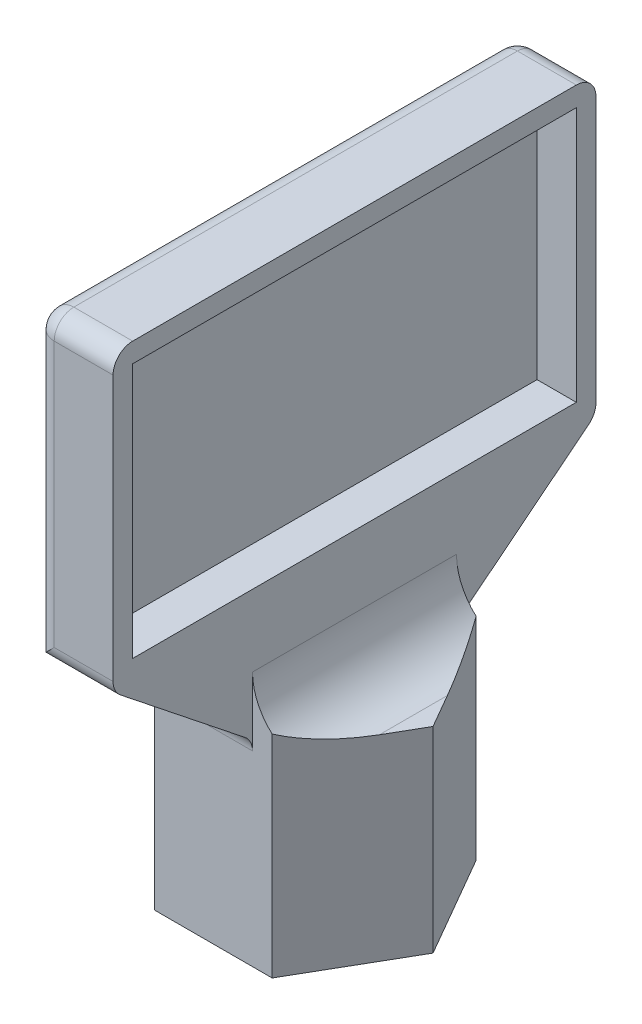
ISO-10303-21;
HEADER;
FILE_DESCRIPTION(('STEP AP214'),'2;1');
FILE_NAME('part.step','',(''),(''),'','','');
FILE_SCHEMA(('AUTOMOTIVE_DESIGN { 1 0 10303 214 1 1 1 1 }'));
ENDSEC;
DATA;
#1=APPLICATION_CONTEXT('core data for automotive mechanical design processes');
#2=APPLICATION_PROTOCOL_DEFINITION('international standard','automotive_design',2000,#1);
#3=PRODUCT_CONTEXT('',#1,'mechanical');
#4=PRODUCT('Part','Part','',(#3));
#5=PRODUCT_RELATED_PRODUCT_CATEGORY('part','',(#4));
#6=PRODUCT_DEFINITION_FORMATION('','',#4);
#7=PRODUCT_DEFINITION_CONTEXT('part definition',#1,'design');
#8=PRODUCT_DEFINITION('design','',#6,#7);
#9=PRODUCT_DEFINITION_SHAPE('','',#8);
#10=(LENGTH_UNIT() NAMED_UNIT(*) SI_UNIT(.MILLI.,.METRE.));
#11=(NAMED_UNIT(*) PLANE_ANGLE_UNIT() SI_UNIT($,.RADIAN.));
#12=(NAMED_UNIT(*) SI_UNIT($,.STERADIAN.) SOLID_ANGLE_UNIT());
#13=UNCERTAINTY_MEASURE_WITH_UNIT(LENGTH_MEASURE(1.E-05),#10,'distance_accuracy_value','');
#14=(GEOMETRIC_REPRESENTATION_CONTEXT(3) GLOBAL_UNCERTAINTY_ASSIGNED_CONTEXT((#13)) GLOBAL_UNIT_ASSIGNED_CONTEXT((#10,
#11,#12)) REPRESENTATION_CONTEXT('',''));
#15=CARTESIAN_POINT('',(0.,0.,0.));
#16=DIRECTION('',(0.,0.,1.));
#17=DIRECTION('',(1.,0.,0.));
#18=AXIS2_PLACEMENT_3D('',#15,#16,#17);
#19=CARTESIAN_POINT('',(0.,10.,0.));
#20=DIRECTION('',(0.,1.,0.));
#21=DIRECTION('',(0.,0.,1.));
#22=AXIS2_PLACEMENT_3D('',#19,#20,#21);
#23=PLANE('',#22);
#24=DIRECTION('',(-0.500000000000001,0.,-0.866025403784438));
#25=VECTOR('',#24,1.);
#26=CARTESIAN_POINT('',(6.00000000000006,10.,0.));
#27=LINE('',#26,#25);
#28=CARTESIAN_POINT('',(6.00000000000006,10.,0.));
#29=VERTEX_POINT('',#28);
#30=CARTESIAN_POINT('',(5.,10.,-1.73205080756898));
#31=VERTEX_POINT('',#30);
#32=EDGE_CURVE('E322',#29,#31,#27,.T.);
#33=ORIENTED_EDGE('',*,*,#32,.T.);
#34=DIRECTION('',(0.,0.,1.));
#35=VECTOR('',#34,1.);
#36=CARTESIAN_POINT('',(5.,10.,5.19615242270666));
#37=LINE('',#36,#35);
#38=CARTESIAN_POINT('',(5.,10.,1.732050807569));
#39=VERTEX_POINT('',#38);
#40=EDGE_CURVE('E511',#31,#39,#37,.T.);
#41=ORIENTED_EDGE('',*,*,#40,.T.);
#42=DIRECTION('',(0.499999999999995,0.,-0.866025403784441));
#43=VECTOR('',#42,1.);
#44=CARTESIAN_POINT('',(3.00000000000009,10.,5.19615242270665));
#45=LINE('',#44,#43);
#46=EDGE_CURVE('E319',#39,#29,#45,.T.);
#47=ORIENTED_EDGE('',*,*,#46,.T.);
#48=EDGE_LOOP('',(#33,#41,#47));
#49=FACE_BOUND('',#48,.T.);
#50=ADVANCED_FACE('F41',(#49),#23,.T.);
#51=CARTESIAN_POINT('',(3.00000000000009,10.,5.19615242270665));
#52=DIRECTION('',(-0.866025403784441,0.,-0.499999999999995));
#53=DIRECTION('',(-0.499999999999995,0.,0.866025403784441));
#54=AXIS2_PLACEMENT_3D('',#51,#52,#53);
#55=PLANE('',#54);
#56=DIRECTION('',(0.499999999999995,0.,-0.866025403784441));
#57=VECTOR('',#56,1.);
#58=CARTESIAN_POINT('',(3.00000000000009,0.,5.19615242270665));
#59=LINE('',#58,#57);
#60=CARTESIAN_POINT('',(3.00000000000009,0.,5.19615242270665));
#61=VERTEX_POINT('',#60);
#62=CARTESIAN_POINT('',(6.00000000000006,0.,0.));
#63=VERTEX_POINT('',#62);
#64=EDGE_CURVE('E315',#61,#63,#59,.T.);
#65=ORIENTED_EDGE('',*,*,#64,.T.);
#66=DIRECTION('',(0.,-1.,0.));
#67=VECTOR('',#66,1.);
#68=CARTESIAN_POINT('',(6.00000000000006,10.,0.));
#69=LINE('',#68,#67);
#70=EDGE_CURVE('E367',#29,#63,#69,.T.);
#71=ORIENTED_EDGE('',*,*,#70,.F.);
#72=ORIENTED_EDGE('',*,*,#46,.F.);
#73=CARTESIAN_POINT('',(5.,13.,1.73205080756901));
#74=DIRECTION('',(-0.866025403784441,0.,-0.499999999999995));
#75=DIRECTION('',(0.499999999999995,0.,-0.866025403784441));
#76=AXIS2_PLACEMENT_3D('',#73,#74,#75);
#77=ELLIPSE('',#76,6.00000000000006,3.);
#78=CARTESIAN_POINT('',(3.00000000000009,10.7639320225001,5.19615242270665));
#79=VERTEX_POINT('',#78);
#80=EDGE_CURVE('E534',#39,#79,#77,.T.);
#81=ORIENTED_EDGE('',*,*,#80,.T.);
#82=DIRECTION('',(0.,-1.,0.));
#83=VECTOR('',#82,1.);
#84=CARTESIAN_POINT('',(3.00000000000009,10.,5.19615242270665));
#85=LINE('',#84,#83);
#86=EDGE_CURVE('E64',#79,#61,#85,.T.);
#87=ORIENTED_EDGE('',*,*,#86,.T.);
#88=EDGE_LOOP('',(#65,#71,#72,#81,#87));
#89=FACE_BOUND('',#88,.T.);
#90=ADVANCED_FACE('F555',(#89),#55,.F.);
#91=CARTESIAN_POINT('',(6.00000000000006,10.,0.));
#92=DIRECTION('',(-0.866025403784438,0.,0.500000000000001));
#93=DIRECTION('',(0.500000000000001,0.,0.866025403784438));
#94=AXIS2_PLACEMENT_3D('',#91,#92,#93);
#95=PLANE('',#94);
#96=DIRECTION('',(-0.500000000000001,0.,-0.866025403784438));
#97=VECTOR('',#96,1.);
#98=CARTESIAN_POINT('',(6.00000000000006,0.,0.));
#99=LINE('',#98,#97);
#100=CARTESIAN_POINT('',(3.00000000000002,0.,-5.19615242270669));
#101=VERTEX_POINT('',#100);
#102=EDGE_CURVE('E337',#63,#101,#99,.T.);
#103=ORIENTED_EDGE('',*,*,#102,.T.);
#104=DIRECTION('',(0.,-1.,0.));
#105=VECTOR('',#104,1.);
#106=CARTESIAN_POINT('',(3.00000000000002,10.,-5.19615242270669));
#107=LINE('',#106,#105);
#108=CARTESIAN_POINT('',(3.00000000000002,10.7639320225002,-5.19615242270669));
#109=VERTEX_POINT('',#108);
#110=EDGE_CURVE('E56',#109,#101,#107,.T.);
#111=ORIENTED_EDGE('',*,*,#110,.F.);
#112=CARTESIAN_POINT('',(5.,13.,-1.73205080756898));
#113=DIRECTION('',(-0.866025403784438,0.,0.500000000000001));
#114=DIRECTION('',(-0.500000000000001,0.,-0.866025403784438));
#115=AXIS2_PLACEMENT_3D('',#112,#113,#114);
#116=ELLIPSE('',#115,5.99999999999999,3.);
#117=EDGE_CURVE('E11',#109,#31,#116,.T.);
#118=ORIENTED_EDGE('',*,*,#117,.T.);
#119=ORIENTED_EDGE('',*,*,#32,.F.);
#120=ORIENTED_EDGE('',*,*,#70,.T.);
#121=EDGE_LOOP('',(#103,#111,#118,#119,#120));
#122=FACE_BOUND('',#121,.T.);
#123=ADVANCED_FACE('F550',(#122),#95,.F.);
#124=CARTESIAN_POINT('',(3.00000000000002,10.,-5.19615242270669));
#125=DIRECTION('',(0.,0.,1.));
#126=DIRECTION('',(1.,0.,0.));
#127=AXIS2_PLACEMENT_3D('',#124,#125,#126);
#128=PLANE('',#127);
#129=DIRECTION('',(1.,0.,0.));
#130=VECTOR('',#129,1.);
#131=CARTESIAN_POINT('',(2.00000000000001,9.51771445827896,-5.19615242270667));
#132=LINE('',#131,#130);
#133=CARTESIAN_POINT('',(-2.,9.51771445827891,-5.19615242270661));
#134=VERTEX_POINT('',#133);
#135=CARTESIAN_POINT('',(2.,9.51771445827896,-5.19615242270667));
#136=VERTEX_POINT('',#135);
#137=EDGE_CURVE('E431',#134,#136,#132,.T.);
#138=ORIENTED_EDGE('',*,*,#137,.T.);
#139=DIRECTION('',(0.,1.,0.));
#140=VECTOR('',#139,1.);
#141=CARTESIAN_POINT('',(2.,10.,-5.19615242270667));
#142=LINE('',#141,#140);
#143=CARTESIAN_POINT('',(2.,13.,-5.19615242270667));
#144=VERTEX_POINT('',#143);
#145=EDGE_CURVE('E435',#136,#144,#142,.T.);
#146=ORIENTED_EDGE('',*,*,#145,.T.);
#147=CARTESIAN_POINT('',(5.,13.,-5.19615242270672));
#148=DIRECTION('',(0.,0.,1.));
#149=DIRECTION('',(1.,0.,0.));
#150=AXIS2_PLACEMENT_3D('',#147,#148,#149);
#151=CIRCLE('',#150,3.);
#152=EDGE_CURVE('E50',#144,#109,#151,.T.);
#153=ORIENTED_EDGE('',*,*,#152,.T.);
#154=ORIENTED_EDGE('',*,*,#110,.T.);
#155=DIRECTION('',(-1.,0.,0.));
#156=VECTOR('',#155,1.);
#157=CARTESIAN_POINT('',(3.00000000000002,0.,-5.19615242270669));
#158=LINE('',#157,#156);
#159=CARTESIAN_POINT('',(-2.99999999999992,0.,-5.19615242270659));
#160=VERTEX_POINT('',#159);
#161=EDGE_CURVE('E340',#101,#160,#158,.T.);
#162=ORIENTED_EDGE('',*,*,#161,.T.);
#163=DIRECTION('',(0.,-1.,0.));
#164=VECTOR('',#163,1.);
#165=CARTESIAN_POINT('',(-2.99999999999992,10.,-5.19615242270659));
#166=LINE('',#165,#164);
#167=CARTESIAN_POINT('',(-2.99999999999992,10.7639320225003,-5.19615242270659));
#168=VERTEX_POINT('',#167);
#169=EDGE_CURVE('E361',#168,#160,#166,.T.);
#170=ORIENTED_EDGE('',*,*,#169,.F.);
#171=CARTESIAN_POINT('',(-5.,13.,-5.19615242270655));
#172=DIRECTION('',(0.,0.,1.));
#173=DIRECTION('',(1.,0.,0.));
#174=AXIS2_PLACEMENT_3D('',#171,#172,#173);
#175=CIRCLE('',#174,3.);
#176=CARTESIAN_POINT('',(-2.,13.,-5.19615242270661));
#177=VERTEX_POINT('',#176);
#178=EDGE_CURVE('E530',#168,#177,#175,.T.);
#179=ORIENTED_EDGE('',*,*,#178,.T.);
#180=DIRECTION('',(0.,-1.,0.));
#181=VECTOR('',#180,1.);
#182=CARTESIAN_POINT('',(-2.,0.,-5.19615242270661));
#183=LINE('',#182,#181);
#184=EDGE_CURVE('E427',#177,#134,#183,.T.);
#185=ORIENTED_EDGE('',*,*,#184,.T.);
#186=EDGE_LOOP('',(#138,#146,#153,#154,#162,#170,#179,#185));
#187=FACE_BOUND('',#186,.T.);
#188=ADVANCED_FACE('F543',(#187),#128,.F.);
#189=CARTESIAN_POINT('',(-2.99999999999992,10.,-5.19615242270659));
#190=DIRECTION('',(0.866025403784439,0.,0.5));
#191=DIRECTION('',(0.5,0.,-0.866025403784439));
#192=AXIS2_PLACEMENT_3D('',#189,#190,#191);
#193=PLANE('',#192);
#194=DIRECTION('',(-0.5,0.,0.866025403784439));
#195=VECTOR('',#194,1.);
#196=CARTESIAN_POINT('',(-2.99999999999992,0.,-5.19615242270659));
#197=LINE('',#196,#195);
#198=CARTESIAN_POINT('',(-5.99999999999992,0.,0.));
#199=VERTEX_POINT('',#198);
#200=EDGE_CURVE('E343',#160,#199,#197,.T.);
#201=ORIENTED_EDGE('',*,*,#200,.T.);
#202=DIRECTION('',(0.,-1.,0.));
#203=VECTOR('',#202,1.);
#204=CARTESIAN_POINT('',(-5.99999999999992,10.,0.));
#205=LINE('',#204,#203);
#206=CARTESIAN_POINT('',(-5.99999999999992,10.,0.));
#207=VERTEX_POINT('',#206);
#208=EDGE_CURVE('E357',#207,#199,#205,.T.);
#209=ORIENTED_EDGE('',*,*,#208,.F.);
#210=DIRECTION('',(-0.5,0.,0.866025403784439));
#211=VECTOR('',#210,1.);
#212=CARTESIAN_POINT('',(-2.99999999999992,10.,-5.19615242270659));
#213=LINE('',#212,#211);
#214=CARTESIAN_POINT('',(-5.,10.,-1.7320508075687));
#215=VERTEX_POINT('',#214);
#216=EDGE_CURVE('E327',#215,#207,#213,.T.);
#217=ORIENTED_EDGE('',*,*,#216,.F.);
#218=CARTESIAN_POINT('',(-5.,13.,-1.7320508075687));
#219=DIRECTION('',(0.866025403784439,0.,0.5));
#220=DIRECTION('',(-0.5,0.,0.866025403784439));
#221=AXIS2_PLACEMENT_3D('',#218,#219,#220);
#222=ELLIPSE('',#221,6.,3.);
#223=EDGE_CURVE('E526',#215,#168,#222,.T.);
#224=ORIENTED_EDGE('',*,*,#223,.T.);
#225=ORIENTED_EDGE('',*,*,#169,.T.);
#226=EDGE_LOOP('',(#201,#209,#217,#224,#225));
#227=FACE_BOUND('',#226,.T.);
#228=ADVANCED_FACE('F564',(#227),#193,.F.);
#229=CARTESIAN_POINT('',(-5.99999999999992,10.,0.));
#230=DIRECTION('',(0.866025403784444,0.,-0.49999999999999));
#231=DIRECTION('',(-0.49999999999999,0.,-0.866025403784444));
#232=AXIS2_PLACEMENT_3D('',#229,#230,#231);
#233=PLANE('',#232);
#234=DIRECTION('',(0.49999999999999,0.,0.866025403784444));
#235=VECTOR('',#234,1.);
#236=CARTESIAN_POINT('',(-5.99999999999992,0.,0.));
#237=LINE('',#236,#235);
#238=CARTESIAN_POINT('',(-2.99999999999998,0.,5.19615242270671));
#239=VERTEX_POINT('',#238);
#240=EDGE_CURVE('E346',#199,#239,#237,.T.);
#241=ORIENTED_EDGE('',*,*,#240,.T.);
#242=DIRECTION('',(0.,-1.,0.));
#243=VECTOR('',#242,1.);
#244=CARTESIAN_POINT('',(-2.99999999999998,10.,5.19615242270671));
#245=LINE('',#244,#243);
#246=CARTESIAN_POINT('',(-2.99999999999998,10.7639320225002,5.19615242270671));
#247=VERTEX_POINT('',#246);
#248=EDGE_CURVE('E353',#247,#239,#245,.T.);
#249=ORIENTED_EDGE('',*,*,#248,.F.);
#250=CARTESIAN_POINT('',(-5.,13.,1.73205080756883));
#251=DIRECTION('',(0.866025403784444,0.,-0.49999999999999));
#252=DIRECTION('',(0.49999999999999,0.,0.866025403784444));
#253=AXIS2_PLACEMENT_3D('',#250,#251,#252);
#254=ELLIPSE('',#253,6.00000000000012,3.);
#255=CARTESIAN_POINT('',(-5.,10.,1.73205080756883));
#256=VERTEX_POINT('',#255);
#257=EDGE_CURVE('E523',#247,#256,#254,.T.);
#258=ORIENTED_EDGE('',*,*,#257,.T.);
#259=DIRECTION('',(0.49999999999999,0.,0.866025403784444));
#260=VECTOR('',#259,1.);
#261=CARTESIAN_POINT('',(-5.99999999999992,10.,0.));
#262=LINE('',#261,#260);
#263=EDGE_CURVE('E330',#207,#256,#262,.T.);
#264=ORIENTED_EDGE('',*,*,#263,.F.);
#265=ORIENTED_EDGE('',*,*,#208,.T.);
#266=EDGE_LOOP('',(#241,#249,#258,#264,#265));
#267=FACE_BOUND('',#266,.T.);
#268=ADVANCED_FACE('F669',(#267),#233,.F.);
#269=CARTESIAN_POINT('',(-2.99999999999998,10.,5.19615242270671));
#270=DIRECTION('',(0.,0.,-1.));
#271=DIRECTION('',(-1.,0.,0.));
#272=AXIS2_PLACEMENT_3D('',#269,#270,#271);
#273=PLANE('',#272);
#274=ORIENTED_EDGE('',*,*,#86,.F.);
#275=CARTESIAN_POINT('',(5.,13.,5.19615242270663));
#276=DIRECTION('',(0.,0.,-1.));
#277=DIRECTION('',(-1.,0.,0.));
#278=AXIS2_PLACEMENT_3D('',#275,#276,#277);
#279=CIRCLE('',#278,3.);
#280=CARTESIAN_POINT('',(2.,13.,5.19615242270666));
#281=VERTEX_POINT('',#280);
#282=EDGE_CURVE('E537',#79,#281,#279,.T.);
#283=ORIENTED_EDGE('',*,*,#282,.T.);
#284=DIRECTION('',(0.,-1.,0.));
#285=VECTOR('',#284,1.);
#286=CARTESIAN_POINT('',(2.,10.,5.19615242270666));
#287=LINE('',#286,#285);
#288=CARTESIAN_POINT('',(2.,9.51771445827886,5.19615242270666));
#289=VERTEX_POINT('',#288);
#290=EDGE_CURVE('E445',#281,#289,#287,.T.);
#291=ORIENTED_EDGE('',*,*,#290,.T.);
#292=DIRECTION('',(1.,0.,0.));
#293=VECTOR('',#292,1.);
#294=CARTESIAN_POINT('',(-2.99999999999999,9.5177144582789,5.19615242270671));
#295=LINE('',#294,#293);
#296=CARTESIAN_POINT('',(-2.,9.51771445827889,5.1961524227067));
#297=VERTEX_POINT('',#296);
#298=EDGE_CURVE('E441',#289,#297,#295,.F.);
#299=ORIENTED_EDGE('',*,*,#298,.T.);
#300=DIRECTION('',(0.,1.,0.));
#301=VECTOR('',#300,1.);
#302=CARTESIAN_POINT('',(-2.,0.,5.1961524227067));
#303=LINE('',#302,#301);
#304=CARTESIAN_POINT('',(-2.,13.,5.1961524227067));
#305=VERTEX_POINT('',#304);
#306=EDGE_CURVE('E438',#297,#305,#303,.T.);
#307=ORIENTED_EDGE('',*,*,#306,.T.);
#308=CARTESIAN_POINT('',(-5.,13.,5.19615242270673));
#309=DIRECTION('',(0.,0.,-1.));
#310=DIRECTION('',(-1.,0.,0.));
#311=AXIS2_PLACEMENT_3D('',#308,#309,#310);
#312=CIRCLE('',#311,3.);
#313=EDGE_CURVE('E519',#305,#247,#312,.T.);
#314=ORIENTED_EDGE('',*,*,#313,.T.);
#315=ORIENTED_EDGE('',*,*,#248,.T.);
#316=DIRECTION('',(1.,0.,0.));
#317=VECTOR('',#316,1.);
#318=CARTESIAN_POINT('',(-2.99999999999998,0.,5.19615242270671));
#319=LINE('',#318,#317);
#320=EDGE_CURVE('E323',#239,#61,#319,.T.);
#321=ORIENTED_EDGE('',*,*,#320,.T.);
#322=EDGE_LOOP('',(#274,#283,#291,#299,#307,#314,#315,#321));
#323=FACE_BOUND('',#322,.T.);
#324=ADVANCED_FACE('F583',(#323),#273,.F.);
#325=ORIENTED_EDGE('',*,*,#263,.T.);
#326=DIRECTION('',(0.,0.,1.));
#327=VECTOR('',#326,1.);
#328=CARTESIAN_POINT('',(-5.,10.,0.));
#329=LINE('',#328,#327);
#330=EDGE_CURVE('E508',#256,#215,#329,.F.);
#331=ORIENTED_EDGE('',*,*,#330,.T.);
#332=ORIENTED_EDGE('',*,*,#216,.T.);
#333=EDGE_LOOP('',(#325,#331,#332));
#334=FACE_BOUND('',#333,.T.);
#335=ADVANCED_FACE('F654',(#334),#23,.T.);
#336=CARTESIAN_POINT('',(0.,0.,0.));
#337=DIRECTION('',(0.,1.,0.));
#338=DIRECTION('',(0.,0.,1.));
#339=AXIS2_PLACEMENT_3D('',#336,#337,#338);
#340=PLANE('',#339);
#341=CARTESIAN_POINT('',(0.,0.,0.));
#342=DIRECTION('',(0.,-1.,0.));
#343=DIRECTION('',(0.,0.,-1.));
#344=AXIS2_PLACEMENT_3D('',#341,#342,#343);
#345=CIRCLE('',#344,3.);
#346=CARTESIAN_POINT('',(0.,0.,-3.));
#347=VERTEX_POINT('',#346);
#348=EDGE_CURVE('E310',#347,#347,#345,.T.);
#349=ORIENTED_EDGE('',*,*,#348,.F.);
#350=EDGE_LOOP('',(#349));
#351=FACE_BOUND('',#350,.T.);
#352=ORIENTED_EDGE('',*,*,#64,.F.);
#353=ORIENTED_EDGE('',*,*,#320,.F.);
#354=ORIENTED_EDGE('',*,*,#240,.F.);
#355=ORIENTED_EDGE('',*,*,#200,.F.);
#356=ORIENTED_EDGE('',*,*,#161,.F.);
#357=ORIENTED_EDGE('',*,*,#102,.F.);
#358=EDGE_LOOP('',(#352,#353,#354,#355,#356,#357));
#359=FACE_BOUND('',#358,.T.);
#360=ADVANCED_FACE('F559',(#351,#359),#340,.F.);
#361=CARTESIAN_POINT('',(0.,8.,0.));
#362=DIRECTION('',(0.,-1.,0.));
#363=DIRECTION('',(0.,0.,-1.));
#364=AXIS2_PLACEMENT_3D('',#361,#362,#363);
#365=CYLINDRICAL_SURFACE('',#364,3.);
#366=CARTESIAN_POINT('',(0.,8.,0.));
#367=DIRECTION('',(0.,-1.,0.));
#368=DIRECTION('',(0.,0.,-1.));
#369=AXIS2_PLACEMENT_3D('',#366,#367,#368);
#370=CIRCLE('',#369,3.);
#371=CARTESIAN_POINT('',(0.,8.,-3.));
#372=VERTEX_POINT('',#371);
#373=EDGE_CURVE('E311',#372,#372,#370,.T.);
#374=ORIENTED_EDGE('',*,*,#373,.F.);
#375=EDGE_LOOP('',(#374));
#376=FACE_BOUND('',#375,.T.);
#377=ORIENTED_EDGE('',*,*,#348,.T.);
#378=EDGE_LOOP('',(#377));
#379=FACE_BOUND('',#378,.T.);
#380=ADVANCED_FACE('F667',(#376,#379),#365,.F.);
#381=CARTESIAN_POINT('',(0.,8.,0.));
#382=DIRECTION('',(0.,-1.,0.));
#383=DIRECTION('',(0.,0.,-1.));
#384=AXIS2_PLACEMENT_3D('',#381,#382,#383);
#385=PLANE('',#384);
#386=ORIENTED_EDGE('',*,*,#373,.T.);
#387=EDGE_LOOP('',(#386));
#388=FACE_BOUND('',#387,.T.);
#389=ADVANCED_FACE('F887',(#388),#385,.T.);
#390=CARTESIAN_POINT('',(-2.,30.6517320353805,0.));
#391=DIRECTION('',(0.,1.,0.));
#392=DIRECTION('',(0.,0.,1.));
#393=AXIS2_PLACEMENT_3D('',#390,#391,#392);
#394=PLANE('',#393);
#395=DIRECTION('',(0.,0.,1.));
#396=VECTOR('',#395,1.);
#397=CARTESIAN_POINT('',(2.,30.6517320353805,0.));
#398=LINE('',#397,#396);
#399=CARTESIAN_POINT('',(2.,30.6517320353805,-11.3));
#400=VERTEX_POINT('',#399);
#401=CARTESIAN_POINT('',(2.,30.6517320353805,11.3));
#402=VERTEX_POINT('',#401);
#403=EDGE_CURVE('E277',#400,#402,#398,.T.);
#404=ORIENTED_EDGE('',*,*,#403,.F.);
#405=DIRECTION('',(1.,0.,0.));
#406=VECTOR('',#405,1.);
#407=CARTESIAN_POINT('',(-2.,30.6517320353805,-11.3));
#408=LINE('',#407,#406);
#409=CARTESIAN_POINT('',(-1.,30.6517320353805,-11.3));
#410=VERTEX_POINT('',#409);
#411=EDGE_CURVE('E405',#400,#410,#408,.F.);
#412=ORIENTED_EDGE('',*,*,#411,.T.);
#413=DIRECTION('',(0.,0.,1.));
#414=VECTOR('',#413,1.);
#415=CARTESIAN_POINT('',(-1.,30.6517320353805,12.3));
#416=LINE('',#415,#414);
#417=CARTESIAN_POINT('',(-1.,30.6517320353805,11.3));
#418=VERTEX_POINT('',#417);
#419=EDGE_CURVE('E402',#410,#418,#416,.T.);
#420=ORIENTED_EDGE('',*,*,#419,.T.);
#421=DIRECTION('',(1.,0.,0.));
#422=VECTOR('',#421,1.);
#423=CARTESIAN_POINT('',(-2.,30.6517320353805,11.3));
#424=LINE('',#423,#422);
#425=EDGE_CURVE('E399',#418,#402,#424,.T.);
#426=ORIENTED_EDGE('',*,*,#425,.T.);
#427=EDGE_LOOP('',(#404,#412,#420,#426));
#428=FACE_BOUND('',#427,.T.);
#429=ADVANCED_FACE('F636',(#428),#394,.T.);
#430=CARTESIAN_POINT('',(-2.,0.,-12.3));
#431=DIRECTION('',(0.,0.,1.));
#432=DIRECTION('',(0.,-1.,0.));
#433=AXIS2_PLACEMENT_3D('',#430,#431,#432);
#434=PLANE('',#433);
#435=DIRECTION('',(0.,-1.,0.));
#436=VECTOR('',#435,1.);
#437=CARTESIAN_POINT('',(2.,0.,-12.3));
#438=LINE('',#437,#436);
#439=CARTESIAN_POINT('',(2.,29.6517320353805,-12.3));
#440=VERTEX_POINT('',#439);
#441=CARTESIAN_POINT('',(2.,16.1340175771016,-12.3));
#442=VERTEX_POINT('',#441);
#443=EDGE_CURVE('E298',#440,#442,#438,.T.);
#444=ORIENTED_EDGE('',*,*,#443,.T.);
#445=DIRECTION('',(1.,0.,0.));
#446=VECTOR('',#445,1.);
#447=CARTESIAN_POINT('',(-2.,16.1340175771016,-12.3));
#448=LINE('',#447,#446);
#449=CARTESIAN_POINT('',(-1.,16.1340175771016,-12.3));
#450=VERTEX_POINT('',#449);
#451=EDGE_CURVE('E396',#442,#450,#448,.F.);
#452=ORIENTED_EDGE('',*,*,#451,.T.);
#453=DIRECTION('',(0.,-1.,0.));
#454=VECTOR('',#453,1.);
#455=CARTESIAN_POINT('',(-1.,0.,-12.3));
#456=LINE('',#455,#454);
#457=CARTESIAN_POINT('',(-1.,29.6517320353805,-12.3));
#458=VERTEX_POINT('',#457);
#459=EDGE_CURVE('E393',#450,#458,#456,.F.);
#460=ORIENTED_EDGE('',*,*,#459,.T.);
#461=DIRECTION('',(1.,0.,0.));
#462=VECTOR('',#461,1.);
#463=CARTESIAN_POINT('',(2.,29.6517320353805,-12.3));
#464=LINE('',#463,#462);
#465=EDGE_CURVE('E390',#458,#440,#464,.T.);
#466=ORIENTED_EDGE('',*,*,#465,.T.);
#467=EDGE_LOOP('',(#444,#452,#460,#466));
#468=FACE_BOUND('',#467,.T.);
#469=ADVANCED_FACE('F628',(#468),#434,.F.);
#470=CARTESIAN_POINT('',(-2.,3.59225482991045,2.85795288828405));
#471=DIRECTION('',(0.,0.782550378864496,0.622587266605279));
#472=DIRECTION('',(0.,-0.622587266605279,0.782550378864496));
#473=AXIS2_PLACEMENT_3D('',#470,#471,#472);
#474=PLANE('',#473);
#475=DIRECTION('',(0.,-0.622587266605279,0.782550378864496));
#476=VECTOR('',#475,1.);
#477=CARTESIAN_POINT('',(2.,3.59225482991045,2.85795288828405));
#478=LINE('',#477,#476);
#479=CARTESIAN_POINT('',(2.,15.3514671982371,-11.9225872666053));
#480=VERTEX_POINT('',#479);
#481=CARTESIAN_POINT('',(2.,10.3002648371435,-5.57356515610139));
#482=VERTEX_POINT('',#481);
#483=EDGE_CURVE('E294',#480,#482,#478,.T.);
#484=ORIENTED_EDGE('',*,*,#483,.T.);
#485=DIRECTION('',(1.,0.,0.));
#486=VECTOR('',#485,1.);
#487=CARTESIAN_POINT('',(-2.00000000000001,10.3002648371434,-5.57356515610133));
#488=LINE('',#487,#486);
#489=CARTESIAN_POINT('',(-2.,10.3002648371434,-5.57356515610133));
#490=VERTEX_POINT('',#489);
#491=EDGE_CURVE('E387',#482,#490,#488,.F.);
#492=ORIENTED_EDGE('',*,*,#491,.T.);
#493=DIRECTION('',(0.,-0.622587266605279,0.782550378864496));
#494=VECTOR('',#493,1.);
#495=CARTESIAN_POINT('',(-2.,3.59225482991045,2.85795288828405));
#496=LINE('',#495,#494);
#497=CARTESIAN_POINT('',(-2.,14.8561445774731,-11.3));
#498=VERTEX_POINT('',#497);
#499=EDGE_CURVE('E306',#498,#490,#496,.T.);
#500=ORIENTED_EDGE('',*,*,#499,.F.);
#501=CARTESIAN_POINT('',(-1.,14.8561445774731,-11.3));
#502=DIRECTION('',(0.,0.782550378864496,0.622587266605279));
#503=DIRECTION('',(0.,-0.622587266605279,0.782550378864496));
#504=AXIS2_PLACEMENT_3D('',#501,#502,#503);
#505=ELLIPSE('',#504,1.27787299962851,1.);
#506=CARTESIAN_POINT('',(-1.7825503788645,15.3514671982371,-11.9225872666053));
#507=VERTEX_POINT('',#506);
#508=EDGE_CURVE('E384',#498,#507,#505,.F.);
#509=ORIENTED_EDGE('',*,*,#508,.T.);
#510=DIRECTION('',(1.,0.,0.));
#511=VECTOR('',#510,1.);
#512=CARTESIAN_POINT('',(-2.,15.3514671982371,-11.9225872666053));
#513=LINE('',#512,#511);
#514=EDGE_CURVE('E381',#507,#480,#513,.T.);
#515=ORIENTED_EDGE('',*,*,#514,.T.);
#516=EDGE_LOOP('',(#484,#492,#500,#509,#515));
#517=FACE_BOUND('',#516,.T.);
#518=ADVANCED_FACE('F620',(#517),#474,.F.);
#519=CARTESIAN_POINT('',(-2.,3.5922548299103,-2.85795288828397));
#520=DIRECTION('',(0.,-0.782550378864491,0.622587266605286));
#521=DIRECTION('',(0.,-0.622587266605286,-0.782550378864491));
#522=AXIS2_PLACEMENT_3D('',#519,#520,#521);
#523=PLANE('',#522);
#524=DIRECTION('',(0.,-0.622587266605286,-0.782550378864491));
#525=VECTOR('',#524,1.);
#526=CARTESIAN_POINT('',(-2.,3.5922548299103,-2.85795288828397));
#527=LINE('',#526,#525);
#528=CARTESIAN_POINT('',(-2.,14.8561445774731,11.3));
#529=VERTEX_POINT('',#528);
#530=CARTESIAN_POINT('',(-2.,10.3002648371434,5.57356515610142));
#531=VERTEX_POINT('',#530);
#532=EDGE_CURVE('E302',#529,#531,#527,.T.);
#533=ORIENTED_EDGE('',*,*,#532,.T.);
#534=DIRECTION('',(1.,0.,0.));
#535=VECTOR('',#534,1.);
#536=CARTESIAN_POINT('',(-1.99999999999986,10.3002648371434,5.57356515610142));
#537=LINE('',#536,#535);
#538=CARTESIAN_POINT('',(2.,10.3002648371433,5.57356515610137));
#539=VERTEX_POINT('',#538);
#540=EDGE_CURVE('E423',#531,#539,#537,.T.);
#541=ORIENTED_EDGE('',*,*,#540,.T.);
#542=DIRECTION('',(0.,-0.622587266605286,-0.782550378864491));
#543=VECTOR('',#542,1.);
#544=CARTESIAN_POINT('',(2.,3.5922548299103,-2.85795288828397));
#545=LINE('',#544,#543);
#546=CARTESIAN_POINT('',(2.,15.3514671982371,11.9225872666053));
#547=VERTEX_POINT('',#546);
#548=EDGE_CURVE('E290',#547,#539,#545,.T.);
#549=ORIENTED_EDGE('',*,*,#548,.F.);
#550=DIRECTION('',(1.,0.,0.));
#551=VECTOR('',#550,1.);
#552=CARTESIAN_POINT('',(-2.,15.3514671982371,11.9225872666053));
#553=LINE('',#552,#551);
#554=CARTESIAN_POINT('',(-1.78255037886449,15.3514671982371,11.9225872666053));
#555=VERTEX_POINT('',#554);
#556=EDGE_CURVE('E417',#547,#555,#553,.F.);
#557=ORIENTED_EDGE('',*,*,#556,.T.);
#558=CARTESIAN_POINT('',(-1.,14.8561445774731,11.3));
#559=DIRECTION('',(0.,-0.782550378864491,0.622587266605286));
#560=DIRECTION('',(0.,0.622587266605286,0.782550378864491));
#561=AXIS2_PLACEMENT_3D('',#558,#559,#560);
#562=ELLIPSE('',#561,1.27787299962852,1.);
#563=EDGE_CURVE('E420',#555,#529,#562,.T.);
#564=ORIENTED_EDGE('',*,*,#563,.T.);
#565=EDGE_LOOP('',(#533,#541,#549,#557,#564));
#566=FACE_BOUND('',#565,.T.);
#567=ADVANCED_FACE('F593',(#566),#523,.T.);
#568=CARTESIAN_POINT('',(-2.,0.,12.3));
#569=DIRECTION('',(0.,0.,1.));
#570=DIRECTION('',(0.,-1.,0.));
#571=AXIS2_PLACEMENT_3D('',#568,#569,#570);
#572=PLANE('',#571);
#573=DIRECTION('',(0.,-1.,0.));
#574=VECTOR('',#573,1.);
#575=CARTESIAN_POINT('',(-1.,15.6517320353805,12.3));
#576=LINE('',#575,#574);
#577=CARTESIAN_POINT('',(-1.,29.6517320353805,12.3));
#578=VERTEX_POINT('',#577);
#579=CARTESIAN_POINT('',(-1.,16.1340175771016,12.3));
#580=VERTEX_POINT('',#579);
#581=EDGE_CURVE('E411',#578,#580,#576,.T.);
#582=ORIENTED_EDGE('',*,*,#581,.T.);
#583=DIRECTION('',(1.,0.,0.));
#584=VECTOR('',#583,1.);
#585=CARTESIAN_POINT('',(-2.,16.1340175771016,12.3));
#586=LINE('',#585,#584);
#587=CARTESIAN_POINT('',(2.,16.1340175771016,12.3));
#588=VERTEX_POINT('',#587);
#589=EDGE_CURVE('E414',#580,#588,#586,.T.);
#590=ORIENTED_EDGE('',*,*,#589,.T.);
#591=DIRECTION('',(0.,-1.,0.));
#592=VECTOR('',#591,1.);
#593=CARTESIAN_POINT('',(2.,0.,12.3));
#594=LINE('',#593,#592);
#595=CARTESIAN_POINT('',(2.,29.6517320353805,12.3));
#596=VERTEX_POINT('',#595);
#597=EDGE_CURVE('E286',#596,#588,#594,.T.);
#598=ORIENTED_EDGE('',*,*,#597,.F.);
#599=DIRECTION('',(1.,0.,0.));
#600=VECTOR('',#599,1.);
#601=CARTESIAN_POINT('',(-2.,29.6517320353805,12.3));
#602=LINE('',#601,#600);
#603=EDGE_CURVE('E408',#596,#578,#602,.F.);
#604=ORIENTED_EDGE('',*,*,#603,.T.);
#605=EDGE_LOOP('',(#582,#590,#598,#604));
#606=FACE_BOUND('',#605,.T.);
#607=ADVANCED_FACE('F835',(#606),#572,.T.);
#608=CARTESIAN_POINT('',(-2.,0.,0.));
#609=DIRECTION('',(1.,0.,0.));
#610=DIRECTION('',(0.,0.,-1.));
#611=AXIS2_PLACEMENT_3D('',#608,#609,#610);
#612=PLANE('',#611);
#613=DIRECTION('',(0.,0.,1.));
#614=VECTOR('',#613,1.);
#615=CARTESIAN_POINT('',(-2.,13.,0.));
#616=LINE('',#615,#614);
#617=EDGE_CURVE('E473',#177,#305,#616,.T.);
#618=ORIENTED_EDGE('',*,*,#617,.T.);
#619=ORIENTED_EDGE('',*,*,#306,.F.);
#620=CARTESIAN_POINT('',(-2.,9.51771445827889,6.1961524227067));
#621=DIRECTION('',(1.,0.,0.));
#622=DIRECTION('',(0.,0.,-1.));
#623=AXIS2_PLACEMENT_3D('',#620,#621,#622);
#624=CIRCLE('',#623,1.);
#625=EDGE_CURVE('E470',#297,#531,#624,.T.);
#626=ORIENTED_EDGE('',*,*,#625,.T.);
#627=ORIENTED_EDGE('',*,*,#532,.F.);
#628=DIRECTION('',(0.,-1.,0.));
#629=VECTOR('',#628,1.);
#630=CARTESIAN_POINT('',(-2.,30.6517320353805,11.3));
#631=LINE('',#630,#629);
#632=CARTESIAN_POINT('',(-2.,29.6517320353805,11.3));
#633=VERTEX_POINT('',#632);
#634=EDGE_CURVE('E371',#529,#633,#631,.F.);
#635=ORIENTED_EDGE('',*,*,#634,.T.);
#636=DIRECTION('',(0.,0.,1.));
#637=VECTOR('',#636,1.);
#638=CARTESIAN_POINT('',(-2.,29.6517320353805,-12.3));
#639=LINE('',#638,#637);
#640=CARTESIAN_POINT('',(-2.,29.6517320353805,-11.3));
#641=VERTEX_POINT('',#640);
#642=EDGE_CURVE('E374',#633,#641,#639,.F.);
#643=ORIENTED_EDGE('',*,*,#642,.T.);
#644=DIRECTION('',(0.,-1.,0.));
#645=VECTOR('',#644,1.);
#646=CARTESIAN_POINT('',(-2.,0.,-11.3));
#647=LINE('',#646,#645);
#648=EDGE_CURVE('E377',#641,#498,#647,.T.);
#649=ORIENTED_EDGE('',*,*,#648,.T.);
#650=ORIENTED_EDGE('',*,*,#499,.T.);
#651=CARTESIAN_POINT('',(-2.,9.51771445827891,-6.19615242270661));
#652=DIRECTION('',(1.,0.,0.));
#653=DIRECTION('',(0.,0.,-1.));
#654=AXIS2_PLACEMENT_3D('',#651,#652,#653);
#655=CIRCLE('',#654,1.);
#656=EDGE_CURVE('E464',#490,#134,#655,.T.);
#657=ORIENTED_EDGE('',*,*,#656,.T.);
#658=ORIENTED_EDGE('',*,*,#184,.F.);
#659=EDGE_LOOP('',(#618,#619,#626,#627,#635,#643,#649,#650,#657,#658));
#660=FACE_BOUND('',#659,.T.);
#661=ADVANCED_FACE('F590',(#660),#612,.F.);
#662=CARTESIAN_POINT('',(2.,0.,0.));
#663=DIRECTION('',(1.,0.,0.));
#664=DIRECTION('',(0.,0.,-1.));
#665=AXIS2_PLACEMENT_3D('',#662,#663,#664);
#666=PLANE('',#665);
#667=DIRECTION('',(0.,1.,0.));
#668=VECTOR('',#667,1.);
#669=CARTESIAN_POINT('',(2.,29.6517320353805,-11.3));
#670=LINE('',#669,#668);
#671=CARTESIAN_POINT('',(2.,16.6517320353805,-11.3));
#672=VERTEX_POINT('',#671);
#673=CARTESIAN_POINT('',(2.,29.6517320353805,-11.3));
#674=VERTEX_POINT('',#673);
#675=EDGE_CURVE('E234',#672,#674,#670,.T.);
#676=ORIENTED_EDGE('',*,*,#675,.F.);
#677=DIRECTION('',(0.,0.,-1.));
#678=VECTOR('',#677,1.);
#679=CARTESIAN_POINT('',(2.,16.6517320353805,11.3));
#680=LINE('',#679,#678);
#681=CARTESIAN_POINT('',(2.,16.6517320353805,11.3));
#682=VERTEX_POINT('',#681);
#683=EDGE_CURVE('E254',#682,#672,#680,.T.);
#684=ORIENTED_EDGE('',*,*,#683,.F.);
#685=DIRECTION('',(0.,-1.,0.));
#686=VECTOR('',#685,1.);
#687=CARTESIAN_POINT('',(2.,29.6517320353805,11.3));
#688=LINE('',#687,#686);
#689=CARTESIAN_POINT('',(2.,29.6517320353805,11.3));
#690=VERTEX_POINT('',#689);
#691=EDGE_CURVE('E258',#690,#682,#688,.T.);
#692=ORIENTED_EDGE('',*,*,#691,.F.);
#693=DIRECTION('',(0.,0.,1.));
#694=VECTOR('',#693,1.);
#695=CARTESIAN_POINT('',(2.,29.6517320353805,11.3));
#696=LINE('',#695,#694);
#697=EDGE_CURVE('E267',#674,#690,#696,.T.);
#698=ORIENTED_EDGE('',*,*,#697,.F.);
#699=EDGE_LOOP('',(#676,#684,#692,#698));
#700=FACE_BOUND('',#699,.T.);
#701=ORIENTED_EDGE('',*,*,#290,.F.);
#702=DIRECTION('',(0.,0.,1.));
#703=VECTOR('',#702,1.);
#704=CARTESIAN_POINT('',(2.,13.,-5.19615242270667));
#705=LINE('',#704,#703);
#706=EDGE_CURVE('E515',#281,#144,#705,.F.);
#707=ORIENTED_EDGE('',*,*,#706,.T.);
#708=ORIENTED_EDGE('',*,*,#145,.F.);
#709=CARTESIAN_POINT('',(2.,9.51771445827896,-6.19615242270667));
#710=DIRECTION('',(1.,0.,0.));
#711=DIRECTION('',(0.,0.,-1.));
#712=AXIS2_PLACEMENT_3D('',#709,#710,#711);
#713=CIRCLE('',#712,1.);
#714=EDGE_CURVE('E461',#136,#482,#713,.F.);
#715=ORIENTED_EDGE('',*,*,#714,.T.);
#716=ORIENTED_EDGE('',*,*,#483,.F.);
#717=CARTESIAN_POINT('',(2.,16.1340175771016,-11.3));
#718=DIRECTION('',(1.,0.,0.));
#719=DIRECTION('',(0.,0.,-1.));
#720=AXIS2_PLACEMENT_3D('',#717,#718,#719);
#721=CIRCLE('',#720,1.);
#722=EDGE_CURVE('E455',#480,#442,#721,.T.);
#723=ORIENTED_EDGE('',*,*,#722,.T.);
#724=ORIENTED_EDGE('',*,*,#443,.F.);
#725=CARTESIAN_POINT('',(2.,29.6517320353805,-11.3));
#726=DIRECTION('',(1.,0.,0.));
#727=DIRECTION('',(0.,0.,-1.));
#728=AXIS2_PLACEMENT_3D('',#725,#726,#727);
#729=CIRCLE('',#728,1.);
#730=EDGE_CURVE('E452',#440,#400,#729,.T.);
#731=ORIENTED_EDGE('',*,*,#730,.T.);
#732=ORIENTED_EDGE('',*,*,#403,.T.);
#733=CARTESIAN_POINT('',(2.,29.6517320353805,11.3));
#734=DIRECTION('',(1.,0.,0.));
#735=DIRECTION('',(0.,0.,-1.));
#736=AXIS2_PLACEMENT_3D('',#733,#734,#735);
#737=CIRCLE('',#736,1.);
#738=EDGE_CURVE('E449',#402,#596,#737,.T.);
#739=ORIENTED_EDGE('',*,*,#738,.T.);
#740=ORIENTED_EDGE('',*,*,#597,.T.);
#741=CARTESIAN_POINT('',(2.,16.1340175771016,11.3));
#742=DIRECTION('',(1.,0.,0.));
#743=DIRECTION('',(0.,0.,-1.));
#744=AXIS2_PLACEMENT_3D('',#741,#742,#743);
#745=CIRCLE('',#744,1.);
#746=EDGE_CURVE('E458',#588,#547,#745,.T.);
#747=ORIENTED_EDGE('',*,*,#746,.T.);
#748=ORIENTED_EDGE('',*,*,#548,.T.);
#749=CARTESIAN_POINT('',(2.,9.51771445827886,6.19615242270666));
#750=DIRECTION('',(1.,0.,0.));
#751=DIRECTION('',(0.,0.,-1.));
#752=AXIS2_PLACEMENT_3D('',#749,#750,#751);
#753=CIRCLE('',#752,1.);
#754=EDGE_CURVE('E467',#539,#289,#753,.F.);
#755=ORIENTED_EDGE('',*,*,#754,.T.);
#756=EDGE_LOOP('',(#701,#707,#708,#715,#716,#723,#724,#731,#732,#739,#740,#747,#748,#755));
#757=FACE_BOUND('',#756,.T.);
#758=ADVANCED_FACE('F582',(#700,#757),#666,.T.);
#759=CARTESIAN_POINT('',(0.,29.6517320353805,-11.3));
#760=DIRECTION('',(0.,0.,-1.));
#761=DIRECTION('',(0.,1.,0.));
#762=AXIS2_PLACEMENT_3D('',#759,#760,#761);
#763=PLANE('',#762);
#764=ORIENTED_EDGE('',*,*,#675,.T.);
#765=DIRECTION('',(1.,0.,0.));
#766=VECTOR('',#765,1.);
#767=CARTESIAN_POINT('',(0.,29.6517320353805,-11.3));
#768=LINE('',#767,#766);
#769=CARTESIAN_POINT('',(0.,29.6517320353805,-11.3));
#770=VERTEX_POINT('',#769);
#771=EDGE_CURVE('E227',#770,#674,#768,.T.);
#772=ORIENTED_EDGE('',*,*,#771,.F.);
#773=DIRECTION('',(0.,1.,0.));
#774=VECTOR('',#773,1.);
#775=CARTESIAN_POINT('',(0.,29.6517320353805,-11.3));
#776=LINE('',#775,#774);
#777=CARTESIAN_POINT('',(0.,16.6517320353805,-11.3));
#778=VERTEX_POINT('',#777);
#779=EDGE_CURVE('E231',#778,#770,#776,.T.);
#780=ORIENTED_EDGE('',*,*,#779,.F.);
#781=DIRECTION('',(1.,0.,0.));
#782=VECTOR('',#781,1.);
#783=CARTESIAN_POINT('',(0.,16.6517320353805,-11.3));
#784=LINE('',#783,#782);
#785=EDGE_CURVE('E274',#778,#672,#784,.T.);
#786=ORIENTED_EDGE('',*,*,#785,.T.);
#787=EDGE_LOOP('',(#764,#772,#780,#786));
#788=FACE_BOUND('',#787,.T.);
#789=ADVANCED_FACE('F229',(#788),#763,.F.);
#790=CARTESIAN_POINT('',(0.,16.6517320353805,11.3));
#791=DIRECTION('',(0.,-1.,0.));
#792=DIRECTION('',(0.,0.,-1.));
#793=AXIS2_PLACEMENT_3D('',#790,#791,#792);
#794=PLANE('',#793);
#795=ORIENTED_EDGE('',*,*,#683,.T.);
#796=ORIENTED_EDGE('',*,*,#785,.F.);
#797=DIRECTION('',(0.,0.,-1.));
#798=VECTOR('',#797,1.);
#799=CARTESIAN_POINT('',(0.,16.6517320353805,11.3));
#800=LINE('',#799,#798);
#801=CARTESIAN_POINT('',(0.,16.6517320353805,11.3));
#802=VERTEX_POINT('',#801);
#803=EDGE_CURVE('E240',#802,#778,#800,.T.);
#804=ORIENTED_EDGE('',*,*,#803,.F.);
#805=DIRECTION('',(1.,0.,0.));
#806=VECTOR('',#805,1.);
#807=CARTESIAN_POINT('',(0.,16.6517320353805,11.3));
#808=LINE('',#807,#806);
#809=EDGE_CURVE('E278',#802,#682,#808,.T.);
#810=ORIENTED_EDGE('',*,*,#809,.T.);
#811=EDGE_LOOP('',(#795,#796,#804,#810));
#812=FACE_BOUND('',#811,.T.);
#813=ADVANCED_FACE('F801',(#812),#794,.F.);
#814=CARTESIAN_POINT('',(0.,29.6517320353805,11.3));
#815=DIRECTION('',(0.,0.,1.));
#816=DIRECTION('',(0.,-1.,0.));
#817=AXIS2_PLACEMENT_3D('',#814,#815,#816);
#818=PLANE('',#817);
#819=ORIENTED_EDGE('',*,*,#691,.T.);
#820=ORIENTED_EDGE('',*,*,#809,.F.);
#821=DIRECTION('',(0.,-1.,0.));
#822=VECTOR('',#821,1.);
#823=CARTESIAN_POINT('',(0.,29.6517320353805,11.3));
#824=LINE('',#823,#822);
#825=CARTESIAN_POINT('',(0.,29.6517320353805,11.3));
#826=VERTEX_POINT('',#825);
#827=EDGE_CURVE('E249',#826,#802,#824,.T.);
#828=ORIENTED_EDGE('',*,*,#827,.F.);
#829=DIRECTION('',(1.,0.,0.));
#830=VECTOR('',#829,1.);
#831=CARTESIAN_POINT('',(0.,29.6517320353805,11.3));
#832=LINE('',#831,#830);
#833=EDGE_CURVE('E239',#826,#690,#832,.T.);
#834=ORIENTED_EDGE('',*,*,#833,.T.);
#835=EDGE_LOOP('',(#819,#820,#828,#834));
#836=FACE_BOUND('',#835,.T.);
#837=ADVANCED_FACE('F793',(#836),#818,.F.);
#838=CARTESIAN_POINT('',(0.,29.6517320353805,11.3));
#839=DIRECTION('',(0.,1.,0.));
#840=DIRECTION('',(0.,0.,1.));
#841=AXIS2_PLACEMENT_3D('',#838,#839,#840);
#842=PLANE('',#841);
#843=ORIENTED_EDGE('',*,*,#697,.T.);
#844=ORIENTED_EDGE('',*,*,#833,.F.);
#845=DIRECTION('',(0.,0.,1.));
#846=VECTOR('',#845,1.);
#847=CARTESIAN_POINT('',(0.,29.6517320353805,11.3));
#848=LINE('',#847,#846);
#849=EDGE_CURVE('E243',#770,#826,#848,.T.);
#850=ORIENTED_EDGE('',*,*,#849,.F.);
#851=ORIENTED_EDGE('',*,*,#771,.T.);
#852=EDGE_LOOP('',(#843,#844,#850,#851));
#853=FACE_BOUND('',#852,.T.);
#854=ADVANCED_FACE('F244',(#853),#842,.F.);
#855=CARTESIAN_POINT('',(0.,0.,0.));
#856=DIRECTION('',(1.,0.,0.));
#857=DIRECTION('',(0.,0.,-1.));
#858=AXIS2_PLACEMENT_3D('',#855,#856,#857);
#859=PLANE('',#858);
#860=ORIENTED_EDGE('',*,*,#779,.T.);
#861=ORIENTED_EDGE('',*,*,#849,.T.);
#862=ORIENTED_EDGE('',*,*,#827,.T.);
#863=ORIENTED_EDGE('',*,*,#803,.T.);
#864=EDGE_LOOP('',(#860,#861,#862,#863));
#865=FACE_BOUND('',#864,.T.);
#866=ADVANCED_FACE('F251',(#865),#859,.T.);
#867=CARTESIAN_POINT('',(-2.,16.1340175771016,11.3));
#868=DIRECTION('',(1.,0.,0.));
#869=DIRECTION('',(0.,0.,-1.));
#870=AXIS2_PLACEMENT_3D('',#867,#868,#869);
#871=CYLINDRICAL_SURFACE('',#870,1.);
#872=ORIENTED_EDGE('',*,*,#746,.F.);
#873=ORIENTED_EDGE('',*,*,#589,.F.);
#874=CARTESIAN_POINT('',(-1.,16.1340175771016,11.3));
#875=DIRECTION('',(0.707106781186547,-0.707106781186547,0.));
#876=DIRECTION('',(0.707106781186547,0.707106781186547,0.));
#877=AXIS2_PLACEMENT_3D('',#874,#875,#876);
#878=ELLIPSE('',#877,1.41421356237309,1.);
#879=EDGE_CURVE('E268',#555,#580,#878,.F.);
#880=ORIENTED_EDGE('',*,*,#879,.F.);
#881=ORIENTED_EDGE('',*,*,#556,.F.);
#882=EDGE_LOOP('',(#872,#873,#880,#881));
#883=FACE_BOUND('',#882,.T.);
#884=ADVANCED_FACE('F768',(#883),#871,.T.);
#885=CARTESIAN_POINT('',(-2.,29.6517320353805,11.3));
#886=DIRECTION('',(1.,0.,0.));
#887=DIRECTION('',(0.,0.,-1.));
#888=AXIS2_PLACEMENT_3D('',#885,#886,#887);
#889=CYLINDRICAL_SURFACE('',#888,1.);
#890=ORIENTED_EDGE('',*,*,#738,.F.);
#891=ORIENTED_EDGE('',*,*,#425,.F.);
#892=CARTESIAN_POINT('',(-1.,29.6517320353805,11.3));
#893=DIRECTION('',(-1.,0.,0.));
#894=DIRECTION('',(0.,0.,1.));
#895=AXIS2_PLACEMENT_3D('',#892,#893,#894);
#896=CIRCLE('',#895,1.);
#897=EDGE_CURVE('E498',#578,#418,#896,.T.);
#898=ORIENTED_EDGE('',*,*,#897,.F.);
#899=ORIENTED_EDGE('',*,*,#603,.F.);
#900=EDGE_LOOP('',(#890,#891,#898,#899));
#901=FACE_BOUND('',#900,.T.);
#902=ADVANCED_FACE('F640',(#901),#889,.T.);
#903=CARTESIAN_POINT('',(-1.,0.,11.3));
#904=DIRECTION('',(0.,1.,0.));
#905=DIRECTION('',(0.,0.,1.));
#906=AXIS2_PLACEMENT_3D('',#903,#904,#905);
#907=CYLINDRICAL_SURFACE('',#906,1.);
#908=ORIENTED_EDGE('',*,*,#879,.T.);
#909=ORIENTED_EDGE('',*,*,#581,.F.);
#910=CARTESIAN_POINT('',(-1.,29.6517320353805,11.3));
#911=DIRECTION('',(0.,1.,0.));
#912=DIRECTION('',(0.,0.,1.));
#913=AXIS2_PLACEMENT_3D('',#910,#911,#912);
#914=CIRCLE('',#913,1.);
#915=EDGE_CURVE('E494',#633,#578,#914,.T.);
#916=ORIENTED_EDGE('',*,*,#915,.F.);
#917=ORIENTED_EDGE('',*,*,#634,.F.);
#918=ORIENTED_EDGE('',*,*,#563,.F.);
#919=EDGE_LOOP('',(#908,#909,#916,#917,#918));
#920=FACE_BOUND('',#919,.T.);
#921=ADVANCED_FACE('F599',(#920),#907,.T.);
#922=CARTESIAN_POINT('',(-1.,29.6517320353805,11.3));
#923=DIRECTION('',(0.,0.,1.));
#924=DIRECTION('',(1.,0.,0.));
#925=AXIS2_PLACEMENT_3D('',#922,#923,#924);
#926=SPHERICAL_SURFACE('',#925,1.);
#927=ORIENTED_EDGE('',*,*,#915,.T.);
#928=ORIENTED_EDGE('',*,*,#897,.T.);
#929=CARTESIAN_POINT('',(-1.,29.6517320353805,11.3));
#930=DIRECTION('',(0.,0.,1.));
#931=DIRECTION('',(1.,0.,0.));
#932=AXIS2_PLACEMENT_3D('',#929,#930,#931);
#933=CIRCLE('',#932,1.);
#934=EDGE_CURVE('E490',#633,#418,#933,.F.);
#935=ORIENTED_EDGE('',*,*,#934,.F.);
#936=EDGE_LOOP('',(#927,#928,#935));
#937=FACE_BOUND('',#936,.T.);
#938=ADVANCED_FACE('F643',(#937),#926,.T.);
#939=CARTESIAN_POINT('',(-2.,29.6517320353805,-11.3));
#940=DIRECTION('',(-1.,0.,0.));
#941=DIRECTION('',(0.,0.,1.));
#942=AXIS2_PLACEMENT_3D('',#939,#940,#941);
#943=CYLINDRICAL_SURFACE('',#942,1.);
#944=ORIENTED_EDGE('',*,*,#730,.F.);
#945=ORIENTED_EDGE('',*,*,#465,.F.);
#946=CARTESIAN_POINT('',(-1.,29.6517320353805,-11.3));
#947=DIRECTION('',(-1.,0.,0.));
#948=DIRECTION('',(0.,0.,1.));
#949=AXIS2_PLACEMENT_3D('',#946,#947,#948);
#950=CIRCLE('',#949,1.);
#951=EDGE_CURVE('E486',#410,#458,#950,.T.);
#952=ORIENTED_EDGE('',*,*,#951,.F.);
#953=ORIENTED_EDGE('',*,*,#411,.F.);
#954=EDGE_LOOP('',(#944,#945,#952,#953));
#955=FACE_BOUND('',#954,.T.);
#956=ADVANCED_FACE('F631',(#955),#943,.T.);
#957=CARTESIAN_POINT('',(-1.,29.6517320353805,0.));
#958=DIRECTION('',(0.,0.,-1.));
#959=DIRECTION('',(-1.,0.,0.));
#960=AXIS2_PLACEMENT_3D('',#957,#958,#959);
#961=CYLINDRICAL_SURFACE('',#960,1.);
#962=ORIENTED_EDGE('',*,*,#934,.T.);
#963=ORIENTED_EDGE('',*,*,#419,.F.);
#964=CARTESIAN_POINT('',(-1.,29.6517320353805,-11.3));
#965=DIRECTION('',(0.,0.,-1.));
#966=DIRECTION('',(-1.,0.,0.));
#967=AXIS2_PLACEMENT_3D('',#964,#965,#966);
#968=CIRCLE('',#967,1.);
#969=EDGE_CURVE('E482',#641,#410,#968,.T.);
#970=ORIENTED_EDGE('',*,*,#969,.F.);
#971=ORIENTED_EDGE('',*,*,#642,.F.);
#972=EDGE_LOOP('',(#962,#963,#970,#971));
#973=FACE_BOUND('',#972,.T.);
#974=ADVANCED_FACE('F610',(#973),#961,.T.);
#975=CARTESIAN_POINT('',(-1.,29.6517320353805,-11.3));
#976=DIRECTION('',(0.,1.,0.));
#977=DIRECTION('',(0.,0.,1.));
#978=AXIS2_PLACEMENT_3D('',#975,#976,#977);
#979=SPHERICAL_SURFACE('',#978,1.);
#980=ORIENTED_EDGE('',*,*,#969,.T.);
#981=ORIENTED_EDGE('',*,*,#951,.T.);
#982=CARTESIAN_POINT('',(-1.,29.6517320353805,-11.3));
#983=DIRECTION('',(0.,1.,0.));
#984=DIRECTION('',(0.,0.,1.));
#985=AXIS2_PLACEMENT_3D('',#982,#983,#984);
#986=CIRCLE('',#985,1.);
#987=EDGE_CURVE('E478',#641,#458,#986,.F.);
#988=ORIENTED_EDGE('',*,*,#987,.F.);
#989=EDGE_LOOP('',(#980,#981,#988));
#990=FACE_BOUND('',#989,.T.);
#991=ADVANCED_FACE('F613',(#990),#979,.T.);
#992=CARTESIAN_POINT('',(-2.,16.1340175771016,-11.3));
#993=DIRECTION('',(1.,0.,0.));
#994=DIRECTION('',(0.,0.,-1.));
#995=AXIS2_PLACEMENT_3D('',#992,#993,#994);
#996=CYLINDRICAL_SURFACE('',#995,1.);
#997=ORIENTED_EDGE('',*,*,#722,.F.);
#998=ORIENTED_EDGE('',*,*,#514,.F.);
#999=CARTESIAN_POINT('',(-1.,16.1340175771016,-11.3));
#1000=DIRECTION('',(0.707106781186547,-0.707106781186547,0.));
#1001=DIRECTION('',(0.707106781186547,0.707106781186547,0.));
#1002=AXIS2_PLACEMENT_3D('',#999,#1000,#1001);
#1003=ELLIPSE('',#1002,1.41421356237309,1.);
#1004=EDGE_CURVE('E474',#450,#507,#1003,.F.);
#1005=ORIENTED_EDGE('',*,*,#1004,.F.);
#1006=ORIENTED_EDGE('',*,*,#451,.F.);
#1007=EDGE_LOOP('',(#997,#998,#1005,#1006));
#1008=FACE_BOUND('',#1007,.T.);
#1009=ADVANCED_FACE('F623',(#1008),#996,.T.);
#1010=CARTESIAN_POINT('',(-1.,0.,-11.3));
#1011=DIRECTION('',(0.,-1.,0.));
#1012=DIRECTION('',(0.,0.,-1.));
#1013=AXIS2_PLACEMENT_3D('',#1010,#1011,#1012);
#1014=CYLINDRICAL_SURFACE('',#1013,1.);
#1015=ORIENTED_EDGE('',*,*,#987,.T.);
#1016=ORIENTED_EDGE('',*,*,#459,.F.);
#1017=ORIENTED_EDGE('',*,*,#1004,.T.);
#1018=ORIENTED_EDGE('',*,*,#508,.F.);
#1019=ORIENTED_EDGE('',*,*,#648,.F.);
#1020=EDGE_LOOP('',(#1015,#1016,#1017,#1018,#1019));
#1021=FACE_BOUND('',#1020,.T.);
#1022=ADVANCED_FACE('F616',(#1021),#1014,.T.);
#1023=CARTESIAN_POINT('',(3.00000000000001,9.51771445827898,-6.19615242270669));
#1024=DIRECTION('',(-1.,0.,0.));
#1025=DIRECTION('',(0.,0.,1.));
#1026=AXIS2_PLACEMENT_3D('',#1023,#1024,#1025);
#1027=CYLINDRICAL_SURFACE('',#1026,1.);
#1028=ORIENTED_EDGE('',*,*,#656,.F.);
#1029=ORIENTED_EDGE('',*,*,#491,.F.);
#1030=ORIENTED_EDGE('',*,*,#714,.F.);
#1031=ORIENTED_EDGE('',*,*,#137,.F.);
#1032=EDGE_LOOP('',(#1028,#1029,#1030,#1031));
#1033=FACE_BOUND('',#1032,.T.);
#1034=ADVANCED_FACE('F578',(#1033),#1027,.F.);
#1035=CARTESIAN_POINT('',(-1.99999999999986,9.51771445827889,6.1961524227067));
#1036=DIRECTION('',(1.,0.,0.));
#1037=DIRECTION('',(0.,0.,-1.));
#1038=AXIS2_PLACEMENT_3D('',#1035,#1036,#1037);
#1039=CYLINDRICAL_SURFACE('',#1038,1.);
#1040=ORIENTED_EDGE('',*,*,#625,.F.);
#1041=ORIENTED_EDGE('',*,*,#298,.F.);
#1042=ORIENTED_EDGE('',*,*,#754,.F.);
#1043=ORIENTED_EDGE('',*,*,#540,.F.);
#1044=EDGE_LOOP('',(#1040,#1041,#1042,#1043));
#1045=FACE_BOUND('',#1044,.T.);
#1046=ADVANCED_FACE('F587',(#1045),#1039,.F.);
#1047=CARTESIAN_POINT('',(-5.,13.,0.));
#1048=DIRECTION('',(0.,0.,1.));
#1049=DIRECTION('',(1.,0.,0.));
#1050=AXIS2_PLACEMENT_3D('',#1047,#1048,#1049);
#1051=CYLINDRICAL_SURFACE('',#1050,3.);
#1052=ORIENTED_EDGE('',*,*,#223,.F.);
#1053=ORIENTED_EDGE('',*,*,#330,.F.);
#1054=ORIENTED_EDGE('',*,*,#257,.F.);
#1055=ORIENTED_EDGE('',*,*,#313,.F.);
#1056=ORIENTED_EDGE('',*,*,#617,.F.);
#1057=ORIENTED_EDGE('',*,*,#178,.F.);
#1058=EDGE_LOOP('',(#1052,#1053,#1054,#1055,#1056,#1057));
#1059=FACE_BOUND('',#1058,.T.);
#1060=ADVANCED_FACE('F572',(#1059),#1051,.F.);
#1061=CARTESIAN_POINT('',(5.,13.,0.));
#1062=DIRECTION('',(0.,0.,-1.));
#1063=DIRECTION('',(-1.,0.,0.));
#1064=AXIS2_PLACEMENT_3D('',#1061,#1062,#1063);
#1065=CYLINDRICAL_SURFACE('',#1064,3.);
#1066=ORIENTED_EDGE('',*,*,#152,.F.);
#1067=ORIENTED_EDGE('',*,*,#706,.F.);
#1068=ORIENTED_EDGE('',*,*,#282,.F.);
#1069=ORIENTED_EDGE('',*,*,#80,.F.);
#1070=ORIENTED_EDGE('',*,*,#40,.F.);
#1071=ORIENTED_EDGE('',*,*,#117,.F.);
#1072=EDGE_LOOP('',(#1066,#1067,#1068,#1069,#1070,#1071));
#1073=FACE_BOUND('',#1072,.T.);
#1074=ADVANCED_FACE('F43',(#1073),#1065,.F.);
#1075=CLOSED_SHELL('',(#50,#90,#123,#188,#228,#268,#324,#335,#360,#380,#389,#429,#469,#518,#567,
#607,#661,#758,#789,#813,#837,#854,#866,#884,#902,#921,#938,#956,#974,#991,#1009,#1022,#1034,
#1046,#1060,#1074));
#1076=MANIFOLD_SOLID_BREP('B2',#1075);
#1077=ADVANCED_BREP_SHAPE_REPRESENTATION('',(#18,#1076),#14);
#1078=SHAPE_DEFINITION_REPRESENTATION(#9,#1077);
ENDSEC;
END-ISO-10303-21;
